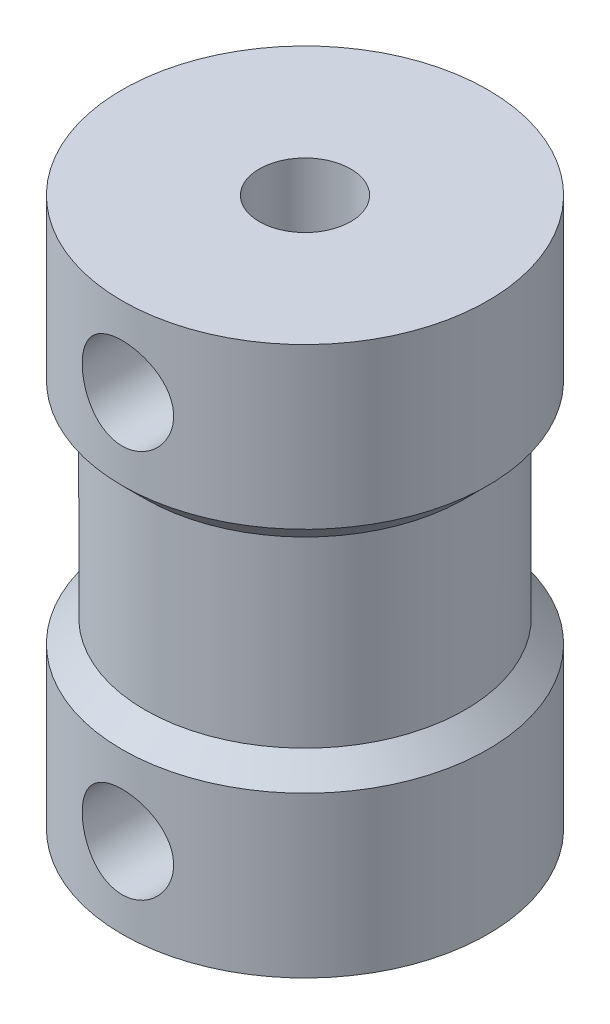
ISO-10303-21;
HEADER;
FILE_DESCRIPTION(('STEP AP214'),'2;1');
FILE_NAME('part.step','',(''),(''),'','','');
FILE_SCHEMA(('AUTOMOTIVE_DESIGN { 1 0 10303 214 1 1 1 1 }'));
ENDSEC;
DATA;
#1=APPLICATION_CONTEXT('core data for automotive mechanical design processes');
#2=APPLICATION_PROTOCOL_DEFINITION('international standard','automotive_design',2000,#1);
#3=PRODUCT_CONTEXT('',#1,'mechanical');
#4=PRODUCT('Part','Part','',(#3));
#5=PRODUCT_RELATED_PRODUCT_CATEGORY('part','',(#4));
#6=PRODUCT_DEFINITION_FORMATION('','',#4);
#7=PRODUCT_DEFINITION_CONTEXT('part definition',#1,'design');
#8=PRODUCT_DEFINITION('design','',#6,#7);
#9=PRODUCT_DEFINITION_SHAPE('','',#8);
#10=(LENGTH_UNIT() NAMED_UNIT(*) SI_UNIT(.MILLI.,.METRE.));
#11=(NAMED_UNIT(*) PLANE_ANGLE_UNIT() SI_UNIT($,.RADIAN.));
#12=(NAMED_UNIT(*) SI_UNIT($,.STERADIAN.) SOLID_ANGLE_UNIT());
#13=UNCERTAINTY_MEASURE_WITH_UNIT(LENGTH_MEASURE(1.E-05),#10,'distance_accuracy_value','');
#14=(GEOMETRIC_REPRESENTATION_CONTEXT(3) GLOBAL_UNCERTAINTY_ASSIGNED_CONTEXT((#13)) GLOBAL_UNIT_ASSIGNED_CONTEXT((#10,
#11,#12)) REPRESENTATION_CONTEXT('',''));
#15=CARTESIAN_POINT('',(0.,0.,0.));
#16=DIRECTION('',(0.,0.,1.));
#17=DIRECTION('',(1.,0.,0.));
#18=AXIS2_PLACEMENT_3D('',#15,#16,#17);
#19=CARTESIAN_POINT('',(0.,6.,0.));
#20=DIRECTION('',(0.,-1.,0.));
#21=DIRECTION('',(0.,0.,-1.));
#22=AXIS2_PLACEMENT_3D('',#19,#20,#21);
#23=CYLINDRICAL_SURFACE('',#22,1.);
#24=CARTESIAN_POINT('',(0.,6.,0.));
#25=DIRECTION('',(0.,1.,0.));
#26=DIRECTION('',(0.,0.,1.));
#27=AXIS2_PLACEMENT_3D('',#24,#25,#26);
#28=CIRCLE('',#27,1.);
#29=CARTESIAN_POINT('',(0.,6.,1.));
#30=VERTEX_POINT('',#29);
#31=EDGE_CURVE('E76',#30,#30,#28,.T.);
#32=ORIENTED_EDGE('',*,*,#31,.T.);
#33=EDGE_LOOP('',(#32));
#34=FACE_BOUND('',#33,.T.);
#35=CARTESIAN_POINT('',(0.,-6.,0.));
#36=DIRECTION('',(0.,1.,0.));
#37=DIRECTION('',(0.,0.,1.));
#38=AXIS2_PLACEMENT_3D('',#35,#36,#37);
#39=CIRCLE('',#38,1.);
#40=CARTESIAN_POINT('',(0.,-6.,1.));
#41=VERTEX_POINT('',#40);
#42=EDGE_CURVE('E70',#41,#41,#39,.T.);
#43=ORIENTED_EDGE('',*,*,#42,.F.);
#44=EDGE_LOOP('',(#43));
#45=FACE_BOUND('',#44,.T.);
#46=CARTESIAN_POINT('',(0.,4.24999999999999,0.));
#47=DIRECTION('',(0.,-0.707106781186547,0.707106781186547));
#48=DIRECTION('',(0.,-0.707106781186547,-0.707106781186547));
#49=AXIS2_PLACEMENT_3D('',#46,#47,#48);
#50=ELLIPSE('',#49,1.41421356237309,1.);
#51=CARTESIAN_POINT('',(1.,4.24999999999999,0.));
#52=VERTEX_POINT('',#51);
#53=CARTESIAN_POINT('',(-1.,4.24999999999999,0.));
#54=VERTEX_POINT('',#53);
#55=EDGE_CURVE('E128',#52,#54,#50,.T.);
#56=ORIENTED_EDGE('',*,*,#55,.T.);
#57=CARTESIAN_POINT('',(0.,4.24999999999999,0.));
#58=DIRECTION('',(0.,-0.707106781186547,-0.707106781186547));
#59=DIRECTION('',(0.,-0.707106781186547,0.707106781186547));
#60=AXIS2_PLACEMENT_3D('',#57,#58,#59);
#61=ELLIPSE('',#60,1.41421356237309,1.);
#62=EDGE_CURVE('E45',#54,#52,#61,.F.);
#63=ORIENTED_EDGE('',*,*,#62,.T.);
#64=EDGE_LOOP('',(#56,#63));
#65=FACE_BOUND('',#64,.T.);
#66=CARTESIAN_POINT('',(0.,-4.24999999999999,0.));
#67=DIRECTION('',(0.,-0.707106781186547,0.707106781186547));
#68=DIRECTION('',(0.,-0.707106781186547,-0.707106781186547));
#69=AXIS2_PLACEMENT_3D('',#66,#67,#68);
#70=ELLIPSE('',#69,1.41421356237309,1.);
#71=CARTESIAN_POINT('',(1.,-4.24999999999999,0.));
#72=VERTEX_POINT('',#71);
#73=CARTESIAN_POINT('',(-1.,-4.24999999999999,0.));
#74=VERTEX_POINT('',#73);
#75=EDGE_CURVE('E62',#72,#74,#70,.T.);
#76=ORIENTED_EDGE('',*,*,#75,.T.);
#77=CARTESIAN_POINT('',(0.,-4.24999999999999,0.));
#78=DIRECTION('',(0.,-0.707106781186547,-0.707106781186547));
#79=DIRECTION('',(0.,-0.707106781186547,0.707106781186547));
#80=AXIS2_PLACEMENT_3D('',#77,#78,#79);
#81=ELLIPSE('',#80,1.41421356237309,1.);
#82=EDGE_CURVE('E51',#74,#72,#81,.F.);
#83=ORIENTED_EDGE('',*,*,#82,.T.);
#84=EDGE_LOOP('',(#76,#83));
#85=FACE_BOUND('',#84,.T.);
#86=ADVANCED_FACE('F33',(#34,#45,#65,#85),#23,.F.);
#87=CARTESIAN_POINT('',(0.,6.,0.));
#88=DIRECTION('',(0.,-1.,0.));
#89=DIRECTION('',(0.,0.,-1.));
#90=AXIS2_PLACEMENT_3D('',#87,#88,#89);
#91=CYLINDRICAL_SURFACE('',#90,4.);
#92=CARTESIAN_POINT('',(0.,-2.49999999999999,0.));
#93=DIRECTION('',(0.,-1.,0.));
#94=DIRECTION('',(0.,0.,-1.));
#95=AXIS2_PLACEMENT_3D('',#92,#93,#94);
#96=CIRCLE('',#95,4.);
#97=CARTESIAN_POINT('',(0.,-2.49999999999999,-4.));
#98=VERTEX_POINT('',#97);
#99=EDGE_CURVE('E122',#98,#98,#96,.T.);
#100=ORIENTED_EDGE('',*,*,#99,.T.);
#101=EDGE_LOOP('',(#100));
#102=FACE_BOUND('',#101,.T.);
#103=CARTESIAN_POINT('',(0.,-6.,0.));
#104=DIRECTION('',(0.,1.,0.));
#105=DIRECTION('',(0.,0.,1.));
#106=AXIS2_PLACEMENT_3D('',#103,#104,#105);
#107=CIRCLE('',#106,4.);
#108=CARTESIAN_POINT('',(0.,-6.,4.));
#109=VERTEX_POINT('',#108);
#110=EDGE_CURVE('E106',#109,#109,#107,.T.);
#111=ORIENTED_EDGE('',*,*,#110,.T.);
#112=EDGE_LOOP('',(#111));
#113=FACE_BOUND('',#112,.T.);
#114=CARTESIAN_POINT('',(0.,-5.24999999999999,4.));
#115=CARTESIAN_POINT('',(0.0552507257798208,-5.24999844950789,3.99999906578675));
#116=CARTESIAN_POINT('',(0.110518771887176,-5.24540563281747,3.99884385421219));
#117=CARTESIAN_POINT('',(0.219470882513688,-5.22718323246199,3.99434742553261));
#118=CARTESIAN_POINT('',(0.273154031247159,-5.21354852697476,3.99100496946646));
#119=CARTESIAN_POINT('',(0.377347248121718,-5.1777071643586,3.98250417554693));
#120=CARTESIAN_POINT('',(0.427861042286668,-5.15551080085647,3.97734801894725));
#121=CARTESIAN_POINT('',(0.524448087936284,-5.10321240663677,3.96576895871729));
#122=CARTESIAN_POINT('',(0.570521189565839,-5.07311010925403,3.95934601236034));
#123=CARTESIAN_POINT('',(0.657867951533946,-5.00519947356385,3.94578275727868));
#124=CARTESIAN_POINT('',(0.699037126707381,-4.96725895002721,3.93863138099022));
#125=CARTESIAN_POINT('',(0.774499284802203,-4.88503186339405,3.92449080078353));
#126=CARTESIAN_POINT('',(0.808791491299423,-4.84074458470233,3.91750161525566));
#127=CARTESIAN_POINT('',(0.870017695199354,-4.7462698488417,3.9043651713314));
#128=CARTESIAN_POINT('',(0.896834810616904,-4.69600451279306,3.89823196313737));
#129=CARTESIAN_POINT('',(0.941597939033684,-4.59150105889442,3.88766329874815));
#130=CARTESIAN_POINT('',(0.959545370292888,-4.53726357778282,3.88322757115193));
#131=CARTESIAN_POINT('',(0.985703224536193,-4.42750433453168,3.87666984478367));
#132=CARTESIAN_POINT('',(0.994101512222225,-4.37203006930013,3.87450327383617));
#133=CARTESIAN_POINT('',(1.00150785004523,-4.26042095399067,3.87259575025161));
#134=CARTESIAN_POINT('',(1.00051742787865,-4.20428621286759,3.87285440299096));
#135=CARTESIAN_POINT('',(0.98932434975952,-4.09438946150367,3.87572803664412));
#136=CARTESIAN_POINT('',(0.979345560127013,-4.04060291902326,3.87828575334586));
#137=CARTESIAN_POINT('',(0.950816124602071,-3.9354926327258,3.88537806450989));
#138=CARTESIAN_POINT('',(0.932264868046282,-3.88416906464734,3.88991279980464));
#139=CARTESIAN_POINT('',(0.886926318624769,-3.78484132249862,3.90050075936124));
#140=CARTESIAN_POINT('',(0.860057778155274,-3.73687588547362,3.90656884979614));
#141=CARTESIAN_POINT('',(0.798904184009969,-3.64605419349544,3.91953140564257));
#142=CARTESIAN_POINT('',(0.764617832539226,-3.60319883462182,3.9264260155649));
#143=CARTESIAN_POINT('',(0.688442283120812,-3.52253092287039,3.94050587026521));
#144=CARTESIAN_POINT('',(0.646364172110573,-3.48489700662576,3.94769379651981));
#145=CARTESIAN_POINT('',(0.556407945002467,-3.41718583835739,3.96137310385857));
#146=CARTESIAN_POINT('',(0.508529651805296,-3.38710881715762,3.96786446366277));
#147=CARTESIAN_POINT('',(0.408077259120928,-3.33529960918374,3.97945154729455));
#148=CARTESIAN_POINT('',(0.355487595472416,-3.31359643983037,3.9845424008515));
#149=CARTESIAN_POINT('',(0.247250672095255,-3.27938846286028,3.99271944660946));
#150=CARTESIAN_POINT('',(0.191603999433656,-3.26688189572124,3.99580602226187));
#151=CARTESIAN_POINT('',(0.0803599802600179,-3.2516949562941,3.9995699951425));
#152=CARTESIAN_POINT('',(0.0247978133254732,-3.24877131594979,4.00030702338852));
#153=CARTESIAN_POINT('',(-0.0860219165343386,-3.25216600137032,3.999458698763));
#154=CARTESIAN_POINT('',(-0.14127950642973,-3.25848349519942,3.99787355494564));
#155=CARTESIAN_POINT('',(-0.249076179184328,-3.27998060559425,3.99259720751571));
#156=CARTESIAN_POINT('',(-0.301643412645837,-3.29502750898465,3.98893756123874));
#157=CARTESIAN_POINT('',(-0.403504861635008,-3.33340472268562,3.97992471089423));
#158=CARTESIAN_POINT('',(-0.452798746021757,-3.35673586954211,3.97457133579928));
#159=CARTESIAN_POINT('',(-0.547682089619898,-3.41149075258315,3.96262205284207));
#160=CARTESIAN_POINT('',(-0.59319029455722,-3.44305074159784,3.95600578244621));
#161=CARTESIAN_POINT('',(-0.678351075762164,-3.51319327253131,3.94229672791613));
#162=CARTESIAN_POINT('',(-0.718002639315339,-3.55177702641127,3.93520386167803));
#163=CARTESIAN_POINT('',(-0.79132704538182,-3.63600130722964,3.92112637973847));
#164=CARTESIAN_POINT('',(-0.824829245081355,-3.68179180200161,3.91414869458187));
#165=CARTESIAN_POINT('',(-0.883673839341798,-3.77848842297714,3.90128585584826));
#166=CARTESIAN_POINT('',(-0.909016596105291,-3.82939432197316,3.89540065378017));
#167=CARTESIAN_POINT('',(-0.950634280406195,-3.93460381494205,3.88545396489777));
#168=CARTESIAN_POINT('',(-0.96696293110271,-3.98888508556267,3.88138170194604));
#169=CARTESIAN_POINT('',(-0.990230439969186,-4.09953975859273,3.87551162726789));
#170=CARTESIAN_POINT('',(-0.997171351652438,-4.15591270068832,3.87371331813291));
#171=CARTESIAN_POINT('',(-1.00135906022266,-4.26741401590346,3.87263267469305));
#172=CARTESIAN_POINT('',(-0.998878598520078,-4.32253162341648,3.87327955152176));
#173=CARTESIAN_POINT('',(-0.984918185541911,-4.43153592577865,3.87685272671895));
#174=CARTESIAN_POINT('',(-0.973438415124513,-4.48542264534243,3.87977897927904));
#175=CARTESIAN_POINT('',(-0.941954212961863,-4.59013897271026,3.88754173788482));
#176=CARTESIAN_POINT('',(-0.922000936453584,-4.64098487016013,3.89236676824206));
#177=CARTESIAN_POINT('',(-0.874176609070047,-4.73864358847579,3.90338503816552));
#178=CARTESIAN_POINT('',(-0.846304460022792,-4.78545584879127,3.90957846747182));
#179=CARTESIAN_POINT('',(-0.782578499091424,-4.87503641933468,3.92283756175675));
#180=CARTESIAN_POINT('',(-0.746535441941503,-4.91766738228263,3.92992176554505));
#181=CARTESIAN_POINT('',(-0.667859580793157,-4.99636469653026,3.94405351497524));
#182=CARTESIAN_POINT('',(-0.625225214174097,-5.03242948674197,3.95110105151373));
#183=CARTESIAN_POINT('',(-0.533645057801727,-5.09760753904306,3.96451770431775));
#184=CARTESIAN_POINT('',(-0.484598948210925,-5.12658307578105,3.97087222243912));
#185=CARTESIAN_POINT('',(-0.382177373006984,-5.17583164196035,3.98203283316746));
#186=CARTESIAN_POINT('',(-0.32880504229116,-5.19611090709902,3.98684003466521));
#187=CARTESIAN_POINT('',(-0.229606835495648,-5.22438122021976,3.99365373043694));
#188=CARTESIAN_POINT('',(-0.184253447272045,-5.23396749536895,3.9960172336846));
#189=CARTESIAN_POINT('',(-0.0926040476908553,-5.24677729574795,3.99919070154632));
#190=CARTESIAN_POINT('',(-0.0463081074950775,-5.25000129953686,4.00000078300596));
#191=CARTESIAN_POINT('',(0.,-5.24999999999999,4.));
#192=B_SPLINE_CURVE_WITH_KNOTS('',3,(#114,#115,#116,#117,#118,#119,#120,#121,#122,#123,#124,
#125,#126,#127,#128,#129,#130,#131,#132,#133,#134,#135,#136,#137,#138,#139,#140,#141,#142,#143,
#144,#145,#146,#147,#148,#149,#150,#151,#152,#153,#154,#155,#156,#157,#158,#159,#160,#161,#162,
#163,#164,#165,#166,#167,#168,#169,#170,#171,#172,#173,#174,#175,#176,#177,#178,#179,#180,#181,
#182,#183,#184,#185,#186,#187,#188,#189,#190,#191),.UNSPECIFIED.,.T.,.F.,(4,2,2,2,2,2,2,2,2,2,2,
2,2,2,2,2,2,2,2,2,2,2,2,2,2,2,2,2,2,2,2,2,2,2,2,2,2,2,4),(0.,0.16558247498126,0.331258825175933,
0.49673660152407,0.662219960112886,0.83076290291426,0.999324863867079,1.17039098363871,
1.34142974112912,1.50904196732954,1.67662692075131,1.84014998004679,2.00368468977359,
2.16887018582586,2.33408460557442,2.50401000646013,2.67394059705498,2.84445486006076,
3.01493649125762,3.18105539299517,3.34715934075162,3.51080183009358,3.67446084881527,
3.84102391710235,4.00761575338679,4.17829672802984,4.34897012499672,4.51861503076024,
4.68822282168272,4.85295853599075,5.01769093970689,5.18144267039631,5.34521712091268,
5.51326384273273,5.68135046513612,5.85248123666392,6.02348909214233,6.16228161961433,
6.3010637069536),.UNSPECIFIED.);
#193=CARTESIAN_POINT('',(0.,-5.24999999999999,4.));
#194=VERTEX_POINT('',#193);
#195=EDGE_CURVE('E11',#194,#194,#192,.T.);
#196=ORIENTED_EDGE('',*,*,#195,.F.);
#197=EDGE_LOOP('',(#196));
#198=FACE_BOUND('',#197,.T.);
#199=ADVANCED_FACE('F94',(#102,#113,#198),#91,.T.);
#200=CARTESIAN_POINT('',(0.,2.49999999999999,0.));
#201=DIRECTION('',(0.,1.,0.));
#202=DIRECTION('',(0.,0.,1.));
#203=AXIS2_PLACEMENT_3D('',#200,#201,#202);
#204=CIRCLE('',#203,4.);
#205=CARTESIAN_POINT('',(0.,2.49999999999999,4.));
#206=VERTEX_POINT('',#205);
#207=EDGE_CURVE('E125',#206,#206,#204,.T.);
#208=ORIENTED_EDGE('',*,*,#207,.T.);
#209=EDGE_LOOP('',(#208));
#210=FACE_BOUND('',#209,.T.);
#211=CARTESIAN_POINT('',(0.,6.,0.));
#212=DIRECTION('',(0.,1.,0.));
#213=DIRECTION('',(0.,0.,1.));
#214=AXIS2_PLACEMENT_3D('',#211,#212,#213);
#215=CIRCLE('',#214,4.);
#216=CARTESIAN_POINT('',(0.,6.,4.));
#217=VERTEX_POINT('',#216);
#218=EDGE_CURVE('E112',#217,#217,#215,.T.);
#219=ORIENTED_EDGE('',*,*,#218,.F.);
#220=EDGE_LOOP('',(#219));
#221=FACE_BOUND('',#220,.T.);
#222=CARTESIAN_POINT('',(0.,3.24999999999999,4.));
#223=CARTESIAN_POINT('',(0.0552507257798207,3.2500015504921,3.99999906578675));
#224=CARTESIAN_POINT('',(0.110518771887175,3.25459436718252,3.99884385421219));
#225=CARTESIAN_POINT('',(0.219470882513688,3.272816767538,3.99434742553261));
#226=CARTESIAN_POINT('',(0.273154031247159,3.28645147302523,3.99100496946646));
#227=CARTESIAN_POINT('',(0.377347248121718,3.32229283564139,3.98250417554693));
#228=CARTESIAN_POINT('',(0.427861042286668,3.34448919914351,3.97734801894725));
#229=CARTESIAN_POINT('',(0.524448087936284,3.39678759336322,3.96576895871729));
#230=CARTESIAN_POINT('',(0.570521189565839,3.42688989074595,3.95934601236034));
#231=CARTESIAN_POINT('',(0.657867951533946,3.49480052643613,3.94578275727868));
#232=CARTESIAN_POINT('',(0.699037126707381,3.53274104997278,3.93863138099022));
#233=CARTESIAN_POINT('',(0.774499284802202,3.61496813660594,3.92449080078353));
#234=CARTESIAN_POINT('',(0.808791491299423,3.65925541529766,3.91750161525566));
#235=CARTESIAN_POINT('',(0.870017695199355,3.75373015115828,3.9043651713314));
#236=CARTESIAN_POINT('',(0.896834810616904,3.80399548720693,3.89823196313737));
#237=CARTESIAN_POINT('',(0.941597939033684,3.90849894110557,3.88766329874815));
#238=CARTESIAN_POINT('',(0.959545370292888,3.96273642221717,3.88322757115193));
#239=CARTESIAN_POINT('',(0.985703224536193,4.07249566546831,3.87666984478367));
#240=CARTESIAN_POINT('',(0.994101512222225,4.12796993069986,3.87450327383617));
#241=CARTESIAN_POINT('',(1.00150785004523,4.23957904600931,3.87259575025161));
#242=CARTESIAN_POINT('',(1.00051742787865,4.2957137871324,3.87285440299096));
#243=CARTESIAN_POINT('',(0.98932434975952,4.40561053849631,3.87572803664412));
#244=CARTESIAN_POINT('',(0.979345560127013,4.45939708097672,3.87828575334586));
#245=CARTESIAN_POINT('',(0.950816124602071,4.56450736727419,3.88537806450989));
#246=CARTESIAN_POINT('',(0.932264868046283,4.61583093535265,3.88991279980464));
#247=CARTESIAN_POINT('',(0.88692631862477,4.71515867750137,3.90050075936124));
#248=CARTESIAN_POINT('',(0.860057778155274,4.76312411452636,3.90656884979614));
#249=CARTESIAN_POINT('',(0.79890418400997,4.85394580650455,3.91953140564257));
#250=CARTESIAN_POINT('',(0.764617832539226,4.89680116537816,3.9264260155649));
#251=CARTESIAN_POINT('',(0.688442283120812,4.97746907712959,3.94050587026521));
#252=CARTESIAN_POINT('',(0.646364172110573,5.01510299337423,3.94769379651981));
#253=CARTESIAN_POINT('',(0.556407945002467,5.0828141616426,3.96137310385857));
#254=CARTESIAN_POINT('',(0.508529651805296,5.11289118284237,3.96786446366277));
#255=CARTESIAN_POINT('',(0.408077259120928,5.16470039081625,3.97945154729455));
#256=CARTESIAN_POINT('',(0.355487595472416,5.18640356016961,3.9845424008515));
#257=CARTESIAN_POINT('',(0.247250672095255,5.22061153713971,3.99271944660946));
#258=CARTESIAN_POINT('',(0.191603999433657,5.23311810427875,3.99580602226187));
#259=CARTESIAN_POINT('',(0.0803599802600183,5.24830504370589,3.9995699951425));
#260=CARTESIAN_POINT('',(0.0247978133254737,5.25122868405019,4.00030702338852));
#261=CARTESIAN_POINT('',(-0.0860219165343382,5.24783399862967,3.999458698763));
#262=CARTESIAN_POINT('',(-0.141279506429729,5.24151650480057,3.99787355494564));
#263=CARTESIAN_POINT('',(-0.249076179184327,5.22001939440574,3.99259720751571));
#264=CARTESIAN_POINT('',(-0.301643412645836,5.20497249101533,3.98893756123874));
#265=CARTESIAN_POINT('',(-0.403504861635007,5.16659527731436,3.97992471089423));
#266=CARTESIAN_POINT('',(-0.452798746021756,5.14326413045788,3.97457133579928));
#267=CARTESIAN_POINT('',(-0.547682089619898,5.08850924741684,3.96262205284207));
#268=CARTESIAN_POINT('',(-0.59319029455722,5.05694925840215,3.95600578244621));
#269=CARTESIAN_POINT('',(-0.678351075762163,4.98680672746868,3.94229672791613));
#270=CARTESIAN_POINT('',(-0.718002639315338,4.94822297358872,3.93520386167803));
#271=CARTESIAN_POINT('',(-0.79132704538182,4.86399869277035,3.92112637973847));
#272=CARTESIAN_POINT('',(-0.824829245081355,4.81820819799838,3.91414869458187));
#273=CARTESIAN_POINT('',(-0.883673839341798,4.72151157702285,3.90128585584826));
#274=CARTESIAN_POINT('',(-0.909016596105291,4.67060567802682,3.89540065378017));
#275=CARTESIAN_POINT('',(-0.950634280406194,4.56539618505794,3.88545396489777));
#276=CARTESIAN_POINT('',(-0.96696293110271,4.51111491443732,3.88138170194604));
#277=CARTESIAN_POINT('',(-0.990230439969186,4.40046024140726,3.87551162726789));
#278=CARTESIAN_POINT('',(-0.997171351652438,4.34408729931167,3.87371331813291));
#279=CARTESIAN_POINT('',(-1.00135906022266,4.23258598409653,3.87263267469305));
#280=CARTESIAN_POINT('',(-0.998878598520079,4.17746837658351,3.87327955152176));
#281=CARTESIAN_POINT('',(-0.984918185541911,4.06846407422134,3.87685272671895));
#282=CARTESIAN_POINT('',(-0.973438415124513,4.01457735465756,3.87977897927904));
#283=CARTESIAN_POINT('',(-0.941954212961863,3.90986102728972,3.88754173788482));
#284=CARTESIAN_POINT('',(-0.922000936453584,3.85901512983986,3.89236676824206));
#285=CARTESIAN_POINT('',(-0.874176609070047,3.7613564115242,3.90338503816552));
#286=CARTESIAN_POINT('',(-0.846304460022792,3.71454415120872,3.90957846747182));
#287=CARTESIAN_POINT('',(-0.782578499091425,3.62496358066531,3.92283756175675));
#288=CARTESIAN_POINT('',(-0.746535441941504,3.58233261771735,3.92992176554505));
#289=CARTESIAN_POINT('',(-0.667859580793158,3.50363530346972,3.94405351497524));
#290=CARTESIAN_POINT('',(-0.625225214174097,3.46757051325801,3.95110105151373));
#291=CARTESIAN_POINT('',(-0.533645057801727,3.40239246095692,3.96451770431775));
#292=CARTESIAN_POINT('',(-0.484598948210925,3.37341692421894,3.97087222243912));
#293=CARTESIAN_POINT('',(-0.382177373006985,3.32416835803964,3.98203283316746));
#294=CARTESIAN_POINT('',(-0.32880504229116,3.30388909290097,3.98684003466521));
#295=CARTESIAN_POINT('',(-0.229606835495648,3.27561877978022,3.99365373043694));
#296=CARTESIAN_POINT('',(-0.184253447272046,3.26603250463104,3.9960172336846));
#297=CARTESIAN_POINT('',(-0.0926040476908553,3.25322270425203,3.99919070154632));
#298=CARTESIAN_POINT('',(-0.0463081074950775,3.24999870046313,4.00000078300596));
#299=CARTESIAN_POINT('',(0.,3.24999999999999,4.));
#300=B_SPLINE_CURVE_WITH_KNOTS('',3,(#222,#223,#224,#225,#226,#227,#228,#229,#230,#231,#232,
#233,#234,#235,#236,#237,#238,#239,#240,#241,#242,#243,#244,#245,#246,#247,#248,#249,#250,#251,
#252,#253,#254,#255,#256,#257,#258,#259,#260,#261,#262,#263,#264,#265,#266,#267,#268,#269,#270,
#271,#272,#273,#274,#275,#276,#277,#278,#279,#280,#281,#282,#283,#284,#285,#286,#287,#288,#289,
#290,#291,#292,#293,#294,#295,#296,#297,#298,#299),.UNSPECIFIED.,.T.,.F.,(4,2,2,2,2,2,2,2,2,2,2,
2,2,2,2,2,2,2,2,2,2,2,2,2,2,2,2,2,2,2,2,2,2,2,2,2,2,2,4),(0.,0.16558247498126,0.331258825175933,
0.49673660152407,0.662219960112885,0.830762902914259,0.999324863867079,1.17039098363871,
1.34142974112912,1.50904196732954,1.67662692075131,1.84014998004679,2.00368468977359,
2.16887018582586,2.33408460557442,2.50401000646013,2.67394059705498,2.84445486006076,
3.01493649125762,3.18105539299517,3.34715934075162,3.51080183009358,3.67446084881527,
3.84102391710235,4.00761575338679,4.17829672802984,4.34897012499672,4.51861503076024,
4.68822282168272,4.85295853599075,5.01769093970689,5.18144267039631,5.34521712091267,
5.51326384273273,5.68135046513612,5.85248123666392,6.02348909214233,6.16228161961433,
6.3010637069536),.UNSPECIFIED.);
#301=CARTESIAN_POINT('',(0.,3.24999999999999,4.));
#302=VERTEX_POINT('',#301);
#303=EDGE_CURVE('E67',#302,#302,#300,.T.);
#304=ORIENTED_EDGE('',*,*,#303,.F.);
#305=EDGE_LOOP('',(#304));
#306=FACE_BOUND('',#305,.T.);
#307=ADVANCED_FACE('F78',(#210,#221,#306),#91,.T.);
#308=CARTESIAN_POINT('',(0.,6.,0.));
#309=DIRECTION('',(0.,1.,0.));
#310=DIRECTION('',(0.,0.,1.));
#311=AXIS2_PLACEMENT_3D('',#308,#309,#310);
#312=PLANE('',#311);
#313=ORIENTED_EDGE('',*,*,#218,.T.);
#314=EDGE_LOOP('',(#313));
#315=FACE_BOUND('',#314,.T.);
#316=ORIENTED_EDGE('',*,*,#31,.F.);
#317=EDGE_LOOP('',(#316));
#318=FACE_BOUND('',#317,.T.);
#319=ADVANCED_FACE('F96',(#315,#318),#312,.T.);
#320=CARTESIAN_POINT('',(0.,-6.,0.));
#321=DIRECTION('',(0.,1.,0.));
#322=DIRECTION('',(0.,0.,1.));
#323=AXIS2_PLACEMENT_3D('',#320,#321,#322);
#324=PLANE('',#323);
#325=ORIENTED_EDGE('',*,*,#110,.F.);
#326=EDGE_LOOP('',(#325));
#327=FACE_BOUND('',#326,.T.);
#328=ORIENTED_EDGE('',*,*,#42,.T.);
#329=EDGE_LOOP('',(#328));
#330=FACE_BOUND('',#329,.T.);
#331=ADVANCED_FACE('F90',(#327,#330),#324,.F.);
#332=CARTESIAN_POINT('',(0.,-3.,0.));
#333=DIRECTION('',(0.,1.,0.));
#334=DIRECTION('',(0.,0.,1.));
#335=AXIS2_PLACEMENT_3D('',#332,#333,#334);
#336=CYLINDRICAL_SURFACE('',#335,3.5);
#337=CARTESIAN_POINT('',(0.,-1.99999999999998,0.));
#338=DIRECTION('',(0.,1.,0.));
#339=DIRECTION('',(0.,0.,1.));
#340=AXIS2_PLACEMENT_3D('',#337,#338,#339);
#341=CIRCLE('',#340,3.5);
#342=CARTESIAN_POINT('',(0.,-1.99999999999998,3.5));
#343=VERTEX_POINT('',#342);
#344=EDGE_CURVE('E119',#343,#343,#341,.T.);
#345=ORIENTED_EDGE('',*,*,#344,.T.);
#346=EDGE_LOOP('',(#345));
#347=FACE_BOUND('',#346,.T.);
#348=CARTESIAN_POINT('',(0.,1.99999999999999,0.));
#349=DIRECTION('',(0.,1.,0.));
#350=DIRECTION('',(0.,0.,1.));
#351=AXIS2_PLACEMENT_3D('',#348,#349,#350);
#352=CIRCLE('',#351,3.5);
#353=CARTESIAN_POINT('',(0.,1.99999999999999,3.5));
#354=VERTEX_POINT('',#353);
#355=EDGE_CURVE('E115',#354,#354,#352,.F.);
#356=ORIENTED_EDGE('',*,*,#355,.T.);
#357=EDGE_LOOP('',(#356));
#358=FACE_BOUND('',#357,.T.);
#359=ADVANCED_FACE('F86',(#347,#358),#336,.T.);
#360=CARTESIAN_POINT('',(0.,-1.99999999999998,0.));
#361=DIRECTION('',(0.,-1.,0.));
#362=DIRECTION('',(0.,0.,-1.));
#363=AXIS2_PLACEMENT_3D('',#360,#361,#362);
#364=CONICAL_SURFACE('',#363,3.5,0.785398163397443);
#365=ORIENTED_EDGE('',*,*,#99,.F.);
#366=EDGE_LOOP('',(#365));
#367=FACE_BOUND('',#366,.T.);
#368=ORIENTED_EDGE('',*,*,#344,.F.);
#369=EDGE_LOOP('',(#368));
#370=FACE_BOUND('',#369,.T.);
#371=ADVANCED_FACE('F89',(#367,#370),#364,.T.);
#372=CARTESIAN_POINT('',(0.,3.,0.));
#373=DIRECTION('',(0.,1.,0.));
#374=DIRECTION('',(0.,0.,1.));
#375=AXIS2_PLACEMENT_3D('',#372,#373,#374);
#376=CONICAL_SURFACE('',#375,4.50000000000002,0.785398163397454);
#377=ORIENTED_EDGE('',*,*,#355,.F.);
#378=EDGE_LOOP('',(#377));
#379=FACE_BOUND('',#378,.T.);
#380=ORIENTED_EDGE('',*,*,#207,.F.);
#381=EDGE_LOOP('',(#380));
#382=FACE_BOUND('',#381,.T.);
#383=ADVANCED_FACE('F35',(#379,#382),#376,.T.);
#384=CARTESIAN_POINT('',(0.,4.24999999999999,4.));
#385=DIRECTION('',(0.,0.,-1.));
#386=DIRECTION('',(-1.,0.,0.));
#387=AXIS2_PLACEMENT_3D('',#384,#385,#386);
#388=CYLINDRICAL_SURFACE('',#387,1.);
#389=ORIENTED_EDGE('',*,*,#55,.F.);
#390=ORIENTED_EDGE('',*,*,#62,.F.);
#391=EDGE_LOOP('',(#389,#390));
#392=FACE_BOUND('',#391,.T.);
#393=ORIENTED_EDGE('',*,*,#303,.T.);
#394=EDGE_LOOP('',(#393));
#395=FACE_BOUND('',#394,.T.);
#396=ADVANCED_FACE('F81',(#392,#395),#388,.F.);
#397=CARTESIAN_POINT('',(0.,-4.24999999999999,4.));
#398=DIRECTION('',(0.,0.,-1.));
#399=DIRECTION('',(-1.,0.,0.));
#400=AXIS2_PLACEMENT_3D('',#397,#398,#399);
#401=CYLINDRICAL_SURFACE('',#400,1.);
#402=ORIENTED_EDGE('',*,*,#75,.F.);
#403=ORIENTED_EDGE('',*,*,#82,.F.);
#404=EDGE_LOOP('',(#402,#403));
#405=FACE_BOUND('',#404,.T.);
#406=ORIENTED_EDGE('',*,*,#195,.T.);
#407=EDGE_LOOP('',(#406));
#408=FACE_BOUND('',#407,.T.);
#409=ADVANCED_FACE('F63',(#405,#408),#401,.F.);
#410=CLOSED_SHELL('',(#86,#199,#307,#319,#331,#359,#371,#383,#396,#409));
#411=MANIFOLD_SOLID_BREP('B2',#410);
#412=ADVANCED_BREP_SHAPE_REPRESENTATION('',(#18,#411),#14);
#413=SHAPE_DEFINITION_REPRESENTATION(#9,#412);
ENDSEC;
END-ISO-10303-21;
